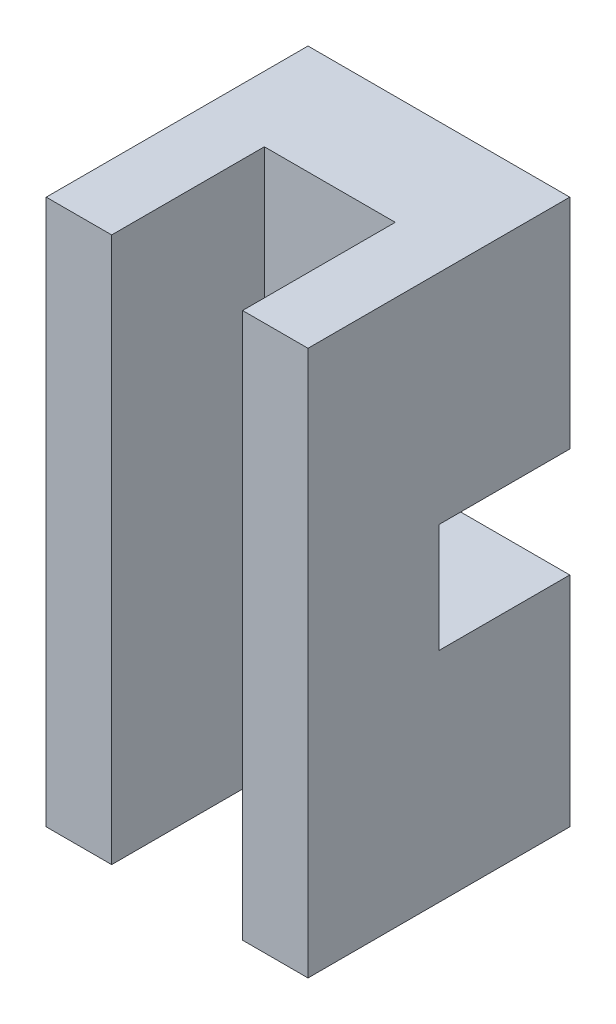
ISO-10303-21;
HEADER;
FILE_DESCRIPTION(('STEP AP214'),'2;1');
FILE_NAME('part.step','',(''),(''),'','','');
FILE_SCHEMA(('AUTOMOTIVE_DESIGN { 1 0 10303 214 1 1 1 1 }'));
ENDSEC;
DATA;
#1=APPLICATION_CONTEXT('core data for automotive mechanical design processes');
#2=APPLICATION_PROTOCOL_DEFINITION('international standard','automotive_design',2000,#1);
#3=PRODUCT_CONTEXT('',#1,'mechanical');
#4=PRODUCT('Part','Part','',(#3));
#5=PRODUCT_RELATED_PRODUCT_CATEGORY('part','',(#4));
#6=PRODUCT_DEFINITION_FORMATION('','',#4);
#7=PRODUCT_DEFINITION_CONTEXT('part definition',#1,'design');
#8=PRODUCT_DEFINITION('design','',#6,#7);
#9=PRODUCT_DEFINITION_SHAPE('','',#8);
#10=(LENGTH_UNIT() NAMED_UNIT(*) SI_UNIT(.MILLI.,.METRE.));
#11=(NAMED_UNIT(*) PLANE_ANGLE_UNIT() SI_UNIT($,.RADIAN.));
#12=(NAMED_UNIT(*) SI_UNIT($,.STERADIAN.) SOLID_ANGLE_UNIT());
#13=UNCERTAINTY_MEASURE_WITH_UNIT(LENGTH_MEASURE(1.E-05),#10,'distance_accuracy_value','');
#14=(GEOMETRIC_REPRESENTATION_CONTEXT(3) GLOBAL_UNCERTAINTY_ASSIGNED_CONTEXT((#13)) GLOBAL_UNIT_ASSIGNED_CONTEXT((#10,
#11,#12)) REPRESENTATION_CONTEXT('',''));
#15=CARTESIAN_POINT('',(0.,0.,0.));
#16=DIRECTION('',(0.,0.,1.));
#17=DIRECTION('',(1.,0.,0.));
#18=AXIS2_PLACEMENT_3D('',#15,#16,#17);
#19=CARTESIAN_POINT('',(30.,62.5,30.));
#20=DIRECTION('',(0.,0.,-1.));
#21=DIRECTION('',(-1.,0.,0.));
#22=AXIS2_PLACEMENT_3D('',#19,#20,#21);
#23=PLANE('',#22);
#24=DIRECTION('',(-1.,0.,0.));
#25=VECTOR('',#24,1.);
#26=CARTESIAN_POINT('',(30.,-62.5,30.));
#27=LINE('',#26,#25);
#28=CARTESIAN_POINT('',(-15.,-62.5,30.));
#29=VERTEX_POINT('',#28);
#30=CARTESIAN_POINT('',(-30.,-62.5,30.));
#31=VERTEX_POINT('',#30);
#32=EDGE_CURVE('E47',#29,#31,#27,.T.);
#33=ORIENTED_EDGE('',*,*,#32,.F.);
#34=DIRECTION('',(0.,1.,0.));
#35=VECTOR('',#34,1.);
#36=CARTESIAN_POINT('',(-15.,-62.5,30.));
#37=LINE('',#36,#35);
#38=CARTESIAN_POINT('',(-15.,62.5,30.));
#39=VERTEX_POINT('',#38);
#40=EDGE_CURVE('E248',#29,#39,#37,.T.);
#41=ORIENTED_EDGE('',*,*,#40,.T.);
#42=DIRECTION('',(-1.,0.,0.));
#43=VECTOR('',#42,1.);
#44=CARTESIAN_POINT('',(30.,62.5,30.));
#45=LINE('',#44,#43);
#46=CARTESIAN_POINT('',(-30.,62.5,30.));
#47=VERTEX_POINT('',#46);
#48=EDGE_CURVE('E200',#39,#47,#45,.T.);
#49=ORIENTED_EDGE('',*,*,#48,.T.);
#50=DIRECTION('',(0.,-1.,0.));
#51=VECTOR('',#50,1.);
#52=CARTESIAN_POINT('',(-30.,62.5,30.));
#53=LINE('',#52,#51);
#54=EDGE_CURVE('E201',#47,#31,#53,.T.);
#55=ORIENTED_EDGE('',*,*,#54,.T.);
#56=EDGE_LOOP('',(#33,#41,#49,#55));
#57=FACE_BOUND('',#56,.T.);
#58=ADVANCED_FACE('F39',(#57),#23,.F.);
#59=CARTESIAN_POINT('',(30.,-12.5,0.));
#60=DIRECTION('',(0.,0.,1.));
#61=DIRECTION('',(1.,0.,0.));
#62=AXIS2_PLACEMENT_3D('',#59,#60,#61);
#63=PLANE('',#62);
#64=DIRECTION('',(-1.,0.,0.));
#65=VECTOR('',#64,1.);
#66=CARTESIAN_POINT('',(30.,12.5,0.));
#67=LINE('',#66,#65);
#68=CARTESIAN_POINT('',(-15.,12.5,0.));
#69=VERTEX_POINT('',#68);
#70=CARTESIAN_POINT('',(-30.,12.5,0.));
#71=VERTEX_POINT('',#70);
#72=EDGE_CURVE('E224',#69,#71,#67,.T.);
#73=ORIENTED_EDGE('',*,*,#72,.F.);
#74=DIRECTION('',(0.,-1.,0.));
#75=VECTOR('',#74,1.);
#76=CARTESIAN_POINT('',(-15.,-12.5,0.));
#77=LINE('',#76,#75);
#78=CARTESIAN_POINT('',(-15.,-12.5,0.));
#79=VERTEX_POINT('',#78);
#80=EDGE_CURVE('E300',#69,#79,#77,.T.);
#81=ORIENTED_EDGE('',*,*,#80,.T.);
#82=DIRECTION('',(-1.,0.,0.));
#83=VECTOR('',#82,1.);
#84=CARTESIAN_POINT('',(30.,-12.5,0.));
#85=LINE('',#84,#83);
#86=CARTESIAN_POINT('',(-30.,-12.5,0.));
#87=VERTEX_POINT('',#86);
#88=EDGE_CURVE('E228',#79,#87,#85,.T.);
#89=ORIENTED_EDGE('',*,*,#88,.T.);
#90=DIRECTION('',(0.,1.,0.));
#91=VECTOR('',#90,1.);
#92=CARTESIAN_POINT('',(-30.,-12.5,0.));
#93=LINE('',#92,#91);
#94=EDGE_CURVE('E211',#87,#71,#93,.T.);
#95=ORIENTED_EDGE('',*,*,#94,.T.);
#96=EDGE_LOOP('',(#73,#81,#89,#95));
#97=FACE_BOUND('',#96,.T.);
#98=ADVANCED_FACE('F269',(#97),#63,.F.);
#99=CARTESIAN_POINT('',(30.,62.5,30.));
#100=VERTEX_POINT('',#99);
#101=CARTESIAN_POINT('',(15.,62.5,30.));
#102=VERTEX_POINT('',#101);
#103=EDGE_CURVE('E164',#100,#102,#45,.T.);
#104=ORIENTED_EDGE('',*,*,#103,.T.);
#105=DIRECTION('',(0.,1.,0.));
#106=VECTOR('',#105,1.);
#107=CARTESIAN_POINT('',(15.,-62.5,30.));
#108=LINE('',#107,#106);
#109=CARTESIAN_POINT('',(15.,-62.5,30.));
#110=VERTEX_POINT('',#109);
#111=EDGE_CURVE('E60',#110,#102,#108,.T.);
#112=ORIENTED_EDGE('',*,*,#111,.F.);
#113=CARTESIAN_POINT('',(30.,-62.5,30.));
#114=VERTEX_POINT('',#113);
#115=EDGE_CURVE('E11',#114,#110,#27,.T.);
#116=ORIENTED_EDGE('',*,*,#115,.F.);
#117=DIRECTION('',(0.,-1.,0.));
#118=VECTOR('',#117,1.);
#119=CARTESIAN_POINT('',(30.,62.5,30.));
#120=LINE('',#119,#118);
#121=EDGE_CURVE('E176',#100,#114,#120,.T.);
#122=ORIENTED_EDGE('',*,*,#121,.F.);
#123=EDGE_LOOP('',(#104,#112,#116,#122));
#124=FACE_BOUND('',#123,.T.);
#125=ADVANCED_FACE('F41',(#124),#23,.F.);
#126=CARTESIAN_POINT('',(30.,-62.5,30.));
#127=DIRECTION('',(0.,1.,0.));
#128=DIRECTION('',(0.,0.,1.));
#129=AXIS2_PLACEMENT_3D('',#126,#127,#128);
#130=PLANE('',#129);
#131=DIRECTION('',(-1.,0.,0.));
#132=VECTOR('',#131,1.);
#133=CARTESIAN_POINT('',(15.,-62.5,-5.00000000000002));
#134=LINE('',#133,#132);
#135=CARTESIAN_POINT('',(15.,-62.5,-5.00000000000002));
#136=VERTEX_POINT('',#135);
#137=CARTESIAN_POINT('',(-15.,-62.5,-5.00000000000002));
#138=VERTEX_POINT('',#137);
#139=EDGE_CURVE('E156',#136,#138,#134,.T.);
#140=ORIENTED_EDGE('',*,*,#139,.T.);
#141=DIRECTION('',(0.,0.,1.));
#142=VECTOR('',#141,1.);
#143=CARTESIAN_POINT('',(-15.,-62.5,-5.00000000000002));
#144=LINE('',#143,#142);
#145=EDGE_CURVE('E165',#138,#29,#144,.T.);
#146=ORIENTED_EDGE('',*,*,#145,.T.);
#147=ORIENTED_EDGE('',*,*,#32,.T.);
#148=DIRECTION('',(0.,0.,-1.));
#149=VECTOR('',#148,1.);
#150=CARTESIAN_POINT('',(-30.,-62.5,30.));
#151=LINE('',#150,#149);
#152=CARTESIAN_POINT('',(-30.,-62.5,-30.));
#153=VERTEX_POINT('',#152);
#154=EDGE_CURVE('E204',#31,#153,#151,.T.);
#155=ORIENTED_EDGE('',*,*,#154,.T.);
#156=DIRECTION('',(-1.,0.,0.));
#157=VECTOR('',#156,1.);
#158=CARTESIAN_POINT('',(30.,-62.5,-30.));
#159=LINE('',#158,#157);
#160=CARTESIAN_POINT('',(30.,-62.5,-30.));
#161=VERTEX_POINT('',#160);
#162=EDGE_CURVE('E172',#161,#153,#159,.T.);
#163=ORIENTED_EDGE('',*,*,#162,.F.);
#164=DIRECTION('',(0.,0.,-1.));
#165=VECTOR('',#164,1.);
#166=CARTESIAN_POINT('',(30.,-62.5,30.));
#167=LINE('',#166,#165);
#168=EDGE_CURVE('E169',#114,#161,#167,.T.);
#169=ORIENTED_EDGE('',*,*,#168,.F.);
#170=ORIENTED_EDGE('',*,*,#115,.T.);
#171=DIRECTION('',(0.,0.,-1.));
#172=VECTOR('',#171,1.);
#173=CARTESIAN_POINT('',(15.,-62.5,30.));
#174=LINE('',#173,#172);
#175=EDGE_CURVE('E149',#110,#136,#174,.T.);
#176=ORIENTED_EDGE('',*,*,#175,.T.);
#177=EDGE_LOOP('',(#140,#146,#147,#155,#163,#169,#170,#176));
#178=FACE_BOUND('',#177,.T.);
#179=ADVANCED_FACE('F167',(#178),#130,.F.);
#180=CARTESIAN_POINT('',(30.,-62.5,-30.));
#181=DIRECTION('',(0.,0.,1.));
#182=DIRECTION('',(0.,-1.,0.));
#183=AXIS2_PLACEMENT_3D('',#180,#181,#182);
#184=PLANE('',#183);
#185=CARTESIAN_POINT('',(0.,-37.5,-30.));
#186=DIRECTION('',(0.,0.,1.));
#187=DIRECTION('',(1.,0.,0.));
#188=AXIS2_PLACEMENT_3D('',#185,#186,#187);
#189=CIRCLE('',#188,5.);
#190=CARTESIAN_POINT('',(5.,-37.5,-30.));
#191=VERTEX_POINT('',#190);
#192=EDGE_CURVE('E315',#191,#191,#189,.T.);
#193=ORIENTED_EDGE('',*,*,#192,.T.);
#194=EDGE_LOOP('',(#193));
#195=FACE_BOUND('',#194,.T.);
#196=DIRECTION('',(0.,1.,0.));
#197=VECTOR('',#196,1.);
#198=CARTESIAN_POINT('',(-30.,-62.5,-30.));
#199=LINE('',#198,#197);
#200=CARTESIAN_POINT('',(-30.,-12.5,-30.));
#201=VERTEX_POINT('',#200);
#202=EDGE_CURVE('E206',#153,#201,#199,.T.);
#203=ORIENTED_EDGE('',*,*,#202,.T.);
#204=DIRECTION('',(-1.,0.,0.));
#205=VECTOR('',#204,1.);
#206=CARTESIAN_POINT('',(30.,-12.5,-30.));
#207=LINE('',#206,#205);
#208=CARTESIAN_POINT('',(30.,-12.5,-30.));
#209=VERTEX_POINT('',#208);
#210=EDGE_CURVE('E232',#209,#201,#207,.T.);
#211=ORIENTED_EDGE('',*,*,#210,.F.);
#212=DIRECTION('',(0.,1.,0.));
#213=VECTOR('',#212,1.);
#214=CARTESIAN_POINT('',(30.,-62.5,-30.));
#215=LINE('',#214,#213);
#216=EDGE_CURVE('E175',#161,#209,#215,.T.);
#217=ORIENTED_EDGE('',*,*,#216,.F.);
#218=ORIENTED_EDGE('',*,*,#162,.T.);
#219=EDGE_LOOP('',(#203,#211,#217,#218));
#220=FACE_BOUND('',#219,.T.);
#221=ADVANCED_FACE('F277',(#195,#220),#184,.F.);
#222=CARTESIAN_POINT('',(30.,-12.5,-30.));
#223=DIRECTION('',(0.,-1.,0.));
#224=DIRECTION('',(0.,0.,-1.));
#225=AXIS2_PLACEMENT_3D('',#222,#223,#224);
#226=PLANE('',#225);
#227=ORIENTED_EDGE('',*,*,#88,.F.);
#228=DIRECTION('',(0.,0.,-1.));
#229=VECTOR('',#228,1.);
#230=CARTESIAN_POINT('',(-15.,-12.5,-30.));
#231=LINE('',#230,#229);
#232=CARTESIAN_POINT('',(-15.,-12.5,-5.00000000000002));
#233=VERTEX_POINT('',#232);
#234=EDGE_CURVE('E187',#79,#233,#231,.T.);
#235=ORIENTED_EDGE('',*,*,#234,.T.);
#236=DIRECTION('',(1.,0.,0.));
#237=VECTOR('',#236,1.);
#238=CARTESIAN_POINT('',(30.,-12.5,-5.00000000000002));
#239=LINE('',#238,#237);
#240=CARTESIAN_POINT('',(15.,-12.5,-5.00000000000002));
#241=VERTEX_POINT('',#240);
#242=EDGE_CURVE('E298',#233,#241,#239,.T.);
#243=ORIENTED_EDGE('',*,*,#242,.T.);
#244=DIRECTION('',(0.,0.,1.));
#245=VECTOR('',#244,1.);
#246=CARTESIAN_POINT('',(15.,-12.5,-30.));
#247=LINE('',#246,#245);
#248=CARTESIAN_POINT('',(15.,-12.5,0.));
#249=VERTEX_POINT('',#248);
#250=EDGE_CURVE('E282',#241,#249,#247,.T.);
#251=ORIENTED_EDGE('',*,*,#250,.T.);
#252=CARTESIAN_POINT('',(30.,-12.5,0.));
#253=VERTEX_POINT('',#252);
#254=EDGE_CURVE('E229',#253,#249,#85,.T.);
#255=ORIENTED_EDGE('',*,*,#254,.F.);
#256=DIRECTION('',(0.,0.,1.));
#257=VECTOR('',#256,1.);
#258=CARTESIAN_POINT('',(30.,-12.5,-30.));
#259=LINE('',#258,#257);
#260=EDGE_CURVE('E191',#209,#253,#259,.T.);
#261=ORIENTED_EDGE('',*,*,#260,.F.);
#262=ORIENTED_EDGE('',*,*,#210,.T.);
#263=DIRECTION('',(0.,0.,1.));
#264=VECTOR('',#263,1.);
#265=CARTESIAN_POINT('',(-30.,-12.5,-30.));
#266=LINE('',#265,#264);
#267=EDGE_CURVE('E208',#201,#87,#266,.T.);
#268=ORIENTED_EDGE('',*,*,#267,.T.);
#269=EDGE_LOOP('',(#227,#235,#243,#251,#255,#261,#262,#268));
#270=FACE_BOUND('',#269,.T.);
#271=ADVANCED_FACE('F272',(#270),#226,.F.);
#272=ORIENTED_EDGE('',*,*,#254,.T.);
#273=DIRECTION('',(0.,1.,0.));
#274=VECTOR('',#273,1.);
#275=CARTESIAN_POINT('',(15.,-12.5,0.));
#276=LINE('',#275,#274);
#277=CARTESIAN_POINT('',(15.,12.5,0.));
#278=VERTEX_POINT('',#277);
#279=EDGE_CURVE('E286',#249,#278,#276,.T.);
#280=ORIENTED_EDGE('',*,*,#279,.T.);
#281=CARTESIAN_POINT('',(30.,12.5,0.));
#282=VERTEX_POINT('',#281);
#283=EDGE_CURVE('E225',#282,#278,#67,.T.);
#284=ORIENTED_EDGE('',*,*,#283,.F.);
#285=DIRECTION('',(0.,1.,0.));
#286=VECTOR('',#285,1.);
#287=CARTESIAN_POINT('',(30.,-12.5,0.));
#288=LINE('',#287,#286);
#289=EDGE_CURVE('E193',#253,#282,#288,.T.);
#290=ORIENTED_EDGE('',*,*,#289,.F.);
#291=EDGE_LOOP('',(#272,#280,#284,#290));
#292=FACE_BOUND('',#291,.T.);
#293=ADVANCED_FACE('F285',(#292),#63,.F.);
#294=CARTESIAN_POINT('',(30.,12.5,0.));
#295=DIRECTION('',(0.,1.,0.));
#296=DIRECTION('',(0.,0.,1.));
#297=AXIS2_PLACEMENT_3D('',#294,#295,#296);
#298=PLANE('',#297);
#299=DIRECTION('',(-1.,0.,0.));
#300=VECTOR('',#299,1.);
#301=CARTESIAN_POINT('',(30.,12.5,-5.00000000000002));
#302=LINE('',#301,#300);
#303=CARTESIAN_POINT('',(15.,12.5,-5.00000000000002));
#304=VERTEX_POINT('',#303);
#305=CARTESIAN_POINT('',(-15.,12.5,-5.00000000000002));
#306=VERTEX_POINT('',#305);
#307=EDGE_CURVE('E289',#304,#306,#302,.T.);
#308=ORIENTED_EDGE('',*,*,#307,.T.);
#309=DIRECTION('',(0.,0.,1.));
#310=VECTOR('',#309,1.);
#311=CARTESIAN_POINT('',(-15.,12.5,0.));
#312=LINE('',#311,#310);
#313=EDGE_CURVE('E266',#306,#69,#312,.T.);
#314=ORIENTED_EDGE('',*,*,#313,.T.);
#315=ORIENTED_EDGE('',*,*,#72,.T.);
#316=DIRECTION('',(0.,0.,-1.));
#317=VECTOR('',#316,1.);
#318=CARTESIAN_POINT('',(-30.,12.5,0.));
#319=LINE('',#318,#317);
#320=CARTESIAN_POINT('',(-30.,12.5,-30.));
#321=VERTEX_POINT('',#320);
#322=EDGE_CURVE('E214',#71,#321,#319,.T.);
#323=ORIENTED_EDGE('',*,*,#322,.T.);
#324=DIRECTION('',(-1.,0.,0.));
#325=VECTOR('',#324,1.);
#326=CARTESIAN_POINT('',(30.,12.5,-30.));
#327=LINE('',#326,#325);
#328=CARTESIAN_POINT('',(30.,12.5,-30.));
#329=VERTEX_POINT('',#328);
#330=EDGE_CURVE('E221',#329,#321,#327,.T.);
#331=ORIENTED_EDGE('',*,*,#330,.F.);
#332=DIRECTION('',(0.,0.,-1.));
#333=VECTOR('',#332,1.);
#334=CARTESIAN_POINT('',(30.,12.5,0.));
#335=LINE('',#334,#333);
#336=EDGE_CURVE('E195',#282,#329,#335,.T.);
#337=ORIENTED_EDGE('',*,*,#336,.F.);
#338=ORIENTED_EDGE('',*,*,#283,.T.);
#339=DIRECTION('',(0.,0.,-1.));
#340=VECTOR('',#339,1.);
#341=CARTESIAN_POINT('',(15.,12.5,0.));
#342=LINE('',#341,#340);
#343=EDGE_CURVE('E288',#278,#304,#342,.T.);
#344=ORIENTED_EDGE('',*,*,#343,.T.);
#345=EDGE_LOOP('',(#308,#314,#315,#323,#331,#337,#338,#344));
#346=FACE_BOUND('',#345,.T.);
#347=ADVANCED_FACE('F263',(#346),#298,.F.);
#348=CARTESIAN_POINT('',(30.,12.5,-30.));
#349=DIRECTION('',(0.,0.,1.));
#350=DIRECTION('',(1.,0.,0.));
#351=AXIS2_PLACEMENT_3D('',#348,#349,#350);
#352=PLANE('',#351);
#353=CARTESIAN_POINT('',(0.,37.5,-30.));
#354=DIRECTION('',(0.,0.,1.));
#355=DIRECTION('',(-1.,0.,0.));
#356=AXIS2_PLACEMENT_3D('',#353,#354,#355);
#357=CIRCLE('',#356,5.);
#358=CARTESIAN_POINT('',(5.,37.5,-30.));
#359=VERTEX_POINT('',#358);
#360=EDGE_CURVE('E321',#359,#359,#357,.T.);
#361=ORIENTED_EDGE('',*,*,#360,.T.);
#362=EDGE_LOOP('',(#361));
#363=FACE_BOUND('',#362,.T.);
#364=DIRECTION('',(0.,1.,0.));
#365=VECTOR('',#364,1.);
#366=CARTESIAN_POINT('',(-30.,12.5,-30.));
#367=LINE('',#366,#365);
#368=CARTESIAN_POINT('',(-30.,62.5,-30.));
#369=VERTEX_POINT('',#368);
#370=EDGE_CURVE('E184',#321,#369,#367,.T.);
#371=ORIENTED_EDGE('',*,*,#370,.T.);
#372=DIRECTION('',(-1.,0.,0.));
#373=VECTOR('',#372,1.);
#374=CARTESIAN_POINT('',(30.,62.5,-30.));
#375=LINE('',#374,#373);
#376=CARTESIAN_POINT('',(30.,62.5,-30.));
#377=VERTEX_POINT('',#376);
#378=EDGE_CURVE('E218',#377,#369,#375,.T.);
#379=ORIENTED_EDGE('',*,*,#378,.F.);
#380=DIRECTION('',(0.,1.,0.));
#381=VECTOR('',#380,1.);
#382=CARTESIAN_POINT('',(30.,12.5,-30.));
#383=LINE('',#382,#381);
#384=EDGE_CURVE('E197',#329,#377,#383,.T.);
#385=ORIENTED_EDGE('',*,*,#384,.F.);
#386=ORIENTED_EDGE('',*,*,#330,.T.);
#387=EDGE_LOOP('',(#371,#379,#385,#386));
#388=FACE_BOUND('',#387,.T.);
#389=ADVANCED_FACE('F257',(#363,#388),#352,.F.);
#390=CARTESIAN_POINT('',(30.,62.5,-30.));
#391=DIRECTION('',(0.,-1.,0.));
#392=DIRECTION('',(0.,0.,-1.));
#393=AXIS2_PLACEMENT_3D('',#390,#391,#392);
#394=PLANE('',#393);
#395=ORIENTED_EDGE('',*,*,#48,.F.);
#396=DIRECTION('',(0.,0.,1.));
#397=VECTOR('',#396,1.);
#398=CARTESIAN_POINT('',(-15.,62.5,-5.00000000000002));
#399=LINE('',#398,#397);
#400=CARTESIAN_POINT('',(-15.,62.5,-5.00000000000002));
#401=VERTEX_POINT('',#400);
#402=EDGE_CURVE('E157',#401,#39,#399,.T.);
#403=ORIENTED_EDGE('',*,*,#402,.F.);
#404=DIRECTION('',(-1.,0.,0.));
#405=VECTOR('',#404,1.);
#406=CARTESIAN_POINT('',(15.,62.5,-5.00000000000002));
#407=LINE('',#406,#405);
#408=CARTESIAN_POINT('',(15.,62.5,-5.00000000000002));
#409=VERTEX_POINT('',#408);
#410=EDGE_CURVE('E313',#409,#401,#407,.T.);
#411=ORIENTED_EDGE('',*,*,#410,.F.);
#412=DIRECTION('',(0.,0.,-1.));
#413=VECTOR('',#412,1.);
#414=CARTESIAN_POINT('',(15.,62.5,30.));
#415=LINE('',#414,#413);
#416=EDGE_CURVE('E314',#102,#409,#415,.T.);
#417=ORIENTED_EDGE('',*,*,#416,.F.);
#418=ORIENTED_EDGE('',*,*,#103,.F.);
#419=DIRECTION('',(0.,0.,1.));
#420=VECTOR('',#419,1.);
#421=CARTESIAN_POINT('',(30.,62.5,-30.));
#422=LINE('',#421,#420);
#423=EDGE_CURVE('E180',#377,#100,#422,.T.);
#424=ORIENTED_EDGE('',*,*,#423,.F.);
#425=ORIENTED_EDGE('',*,*,#378,.T.);
#426=DIRECTION('',(0.,0.,1.));
#427=VECTOR('',#426,1.);
#428=CARTESIAN_POINT('',(-30.,62.5,-30.));
#429=LINE('',#428,#427);
#430=EDGE_CURVE('E181',#369,#47,#429,.T.);
#431=ORIENTED_EDGE('',*,*,#430,.T.);
#432=EDGE_LOOP('',(#395,#403,#411,#417,#418,#424,#425,#431));
#433=FACE_BOUND('',#432,.T.);
#434=ADVANCED_FACE('F251',(#433),#394,.F.);
#435=CARTESIAN_POINT('',(30.,0.,0.));
#436=DIRECTION('',(1.,0.,0.));
#437=DIRECTION('',(0.,0.,-1.));
#438=AXIS2_PLACEMENT_3D('',#435,#436,#437);
#439=PLANE('',#438);
#440=ORIENTED_EDGE('',*,*,#121,.T.);
#441=ORIENTED_EDGE('',*,*,#168,.T.);
#442=ORIENTED_EDGE('',*,*,#216,.T.);
#443=ORIENTED_EDGE('',*,*,#260,.T.);
#444=ORIENTED_EDGE('',*,*,#289,.T.);
#445=ORIENTED_EDGE('',*,*,#336,.T.);
#446=ORIENTED_EDGE('',*,*,#384,.T.);
#447=ORIENTED_EDGE('',*,*,#423,.T.);
#448=EDGE_LOOP('',(#440,#441,#442,#443,#444,#445,#446,#447));
#449=FACE_BOUND('',#448,.T.);
#450=ADVANCED_FACE('F178',(#449),#439,.T.);
#451=CARTESIAN_POINT('',(-30.,0.,0.));
#452=DIRECTION('',(1.,0.,0.));
#453=DIRECTION('',(0.,0.,-1.));
#454=AXIS2_PLACEMENT_3D('',#451,#452,#453);
#455=PLANE('',#454);
#456=ORIENTED_EDGE('',*,*,#54,.F.);
#457=ORIENTED_EDGE('',*,*,#430,.F.);
#458=ORIENTED_EDGE('',*,*,#370,.F.);
#459=ORIENTED_EDGE('',*,*,#322,.F.);
#460=ORIENTED_EDGE('',*,*,#94,.F.);
#461=ORIENTED_EDGE('',*,*,#267,.F.);
#462=ORIENTED_EDGE('',*,*,#202,.F.);
#463=ORIENTED_EDGE('',*,*,#154,.F.);
#464=EDGE_LOOP('',(#456,#457,#458,#459,#460,#461,#462,#463));
#465=FACE_BOUND('',#464,.T.);
#466=ADVANCED_FACE('F244',(#465),#455,.F.);
#467=CARTESIAN_POINT('',(-15.,-62.5,-5.00000000000002));
#468=DIRECTION('',(-1.,0.,0.));
#469=DIRECTION('',(0.,0.,1.));
#470=AXIS2_PLACEMENT_3D('',#467,#468,#469);
#471=PLANE('',#470);
#472=ORIENTED_EDGE('',*,*,#80,.F.);
#473=ORIENTED_EDGE('',*,*,#313,.F.);
#474=DIRECTION('',(0.,1.,0.));
#475=VECTOR('',#474,1.);
#476=CARTESIAN_POINT('',(-15.,-62.5,-5.00000000000002));
#477=LINE('',#476,#475);
#478=EDGE_CURVE('E305',#306,#401,#477,.T.);
#479=ORIENTED_EDGE('',*,*,#478,.T.);
#480=ORIENTED_EDGE('',*,*,#402,.T.);
#481=ORIENTED_EDGE('',*,*,#40,.F.);
#482=ORIENTED_EDGE('',*,*,#145,.F.);
#483=EDGE_CURVE('E292',#138,#233,#477,.T.);
#484=ORIENTED_EDGE('',*,*,#483,.T.);
#485=ORIENTED_EDGE('',*,*,#234,.F.);
#486=EDGE_LOOP('',(#472,#473,#479,#480,#481,#482,#484,#485));
#487=FACE_BOUND('',#486,.T.);
#488=ADVANCED_FACE('F303',(#487),#471,.F.);
#489=CARTESIAN_POINT('',(15.,-62.5,-5.00000000000002));
#490=DIRECTION('',(0.,0.,-1.));
#491=DIRECTION('',(-1.,0.,0.));
#492=AXIS2_PLACEMENT_3D('',#489,#490,#491);
#493=PLANE('',#492);
#494=CARTESIAN_POINT('',(0.,-37.5,-5.00000000000002));
#495=DIRECTION('',(0.,0.,1.));
#496=DIRECTION('',(1.,0.,0.));
#497=AXIS2_PLACEMENT_3D('',#494,#495,#496);
#498=CIRCLE('',#497,5.);
#499=CARTESIAN_POINT('',(5.,-37.5,-5.00000000000002));
#500=VERTEX_POINT('',#499);
#501=EDGE_CURVE('E327',#500,#500,#498,.T.);
#502=ORIENTED_EDGE('',*,*,#501,.F.);
#503=EDGE_LOOP('',(#502));
#504=FACE_BOUND('',#503,.T.);
#505=ORIENTED_EDGE('',*,*,#483,.F.);
#506=ORIENTED_EDGE('',*,*,#139,.F.);
#507=DIRECTION('',(0.,1.,0.));
#508=VECTOR('',#507,1.);
#509=CARTESIAN_POINT('',(15.,-62.5,-5.00000000000002));
#510=LINE('',#509,#508);
#511=EDGE_CURVE('E152',#136,#241,#510,.T.);
#512=ORIENTED_EDGE('',*,*,#511,.T.);
#513=ORIENTED_EDGE('',*,*,#242,.F.);
#514=EDGE_LOOP('',(#505,#506,#512,#513));
#515=FACE_BOUND('',#514,.T.);
#516=ADVANCED_FACE('F341',(#504,#515),#493,.F.);
#517=CARTESIAN_POINT('',(0.,37.5,-5.00000000000002));
#518=DIRECTION('',(0.,0.,1.));
#519=DIRECTION('',(-1.,0.,0.));
#520=AXIS2_PLACEMENT_3D('',#517,#518,#519);
#521=CIRCLE('',#520,5.);
#522=CARTESIAN_POINT('',(5.,37.5,-5.00000000000002));
#523=VERTEX_POINT('',#522);
#524=EDGE_CURVE('E324',#523,#523,#521,.T.);
#525=ORIENTED_EDGE('',*,*,#524,.F.);
#526=EDGE_LOOP('',(#525));
#527=FACE_BOUND('',#526,.T.);
#528=EDGE_CURVE('E54',#304,#409,#510,.T.);
#529=ORIENTED_EDGE('',*,*,#528,.T.);
#530=ORIENTED_EDGE('',*,*,#410,.T.);
#531=ORIENTED_EDGE('',*,*,#478,.F.);
#532=ORIENTED_EDGE('',*,*,#307,.F.);
#533=EDGE_LOOP('',(#529,#530,#531,#532));
#534=FACE_BOUND('',#533,.T.);
#535=ADVANCED_FACE('F310',(#527,#534),#493,.F.);
#536=CARTESIAN_POINT('',(15.,-62.5,30.));
#537=DIRECTION('',(1.,0.,0.));
#538=DIRECTION('',(0.,0.,-1.));
#539=AXIS2_PLACEMENT_3D('',#536,#537,#538);
#540=PLANE('',#539);
#541=ORIENTED_EDGE('',*,*,#511,.F.);
#542=ORIENTED_EDGE('',*,*,#175,.F.);
#543=ORIENTED_EDGE('',*,*,#111,.T.);
#544=ORIENTED_EDGE('',*,*,#416,.T.);
#545=ORIENTED_EDGE('',*,*,#528,.F.);
#546=ORIENTED_EDGE('',*,*,#343,.F.);
#547=ORIENTED_EDGE('',*,*,#279,.F.);
#548=ORIENTED_EDGE('',*,*,#250,.F.);
#549=EDGE_LOOP('',(#541,#542,#543,#544,#545,#546,#547,#548));
#550=FACE_BOUND('',#549,.T.);
#551=ADVANCED_FACE('F150',(#550),#540,.F.);
#552=CARTESIAN_POINT('',(0.,37.5,-30.));
#553=DIRECTION('',(0.,0.,1.));
#554=DIRECTION('',(1.,0.,0.));
#555=AXIS2_PLACEMENT_3D('',#552,#553,#554);
#556=CYLINDRICAL_SURFACE('',#555,5.);
#557=CARTESIAN_POINT('',(5.,37.5,-30.));
#558=CARTESIAN_POINT('',(5.,37.5,-29.7395833333333));
#559=CARTESIAN_POINT('',(5.,37.5,-29.4791666666667));
#560=CARTESIAN_POINT('',(5.,37.5,-28.9583333333333));
#561=CARTESIAN_POINT('',(5.,37.5,-28.6979166666667));
#562=CARTESIAN_POINT('',(5.,37.5,-28.1770833333333));
#563=CARTESIAN_POINT('',(5.,37.5,-27.9166666666667));
#564=CARTESIAN_POINT('',(5.,37.5,-27.3958333333333));
#565=CARTESIAN_POINT('',(5.,37.5,-27.1354166666667));
#566=CARTESIAN_POINT('',(5.,37.5,-26.6145833333333));
#567=CARTESIAN_POINT('',(5.,37.5,-26.3541666666667));
#568=CARTESIAN_POINT('',(5.,37.5,-25.8333333333333));
#569=CARTESIAN_POINT('',(5.,37.5,-25.5729166666667));
#570=CARTESIAN_POINT('',(5.,37.5,-25.0520833333333));
#571=CARTESIAN_POINT('',(5.,37.5,-24.7916666666667));
#572=CARTESIAN_POINT('',(5.,37.5,-24.2708333333333));
#573=CARTESIAN_POINT('',(5.,37.5,-24.0104166666667));
#574=CARTESIAN_POINT('',(5.,37.5,-23.4895833333333));
#575=CARTESIAN_POINT('',(5.,37.5,-23.2291666666667));
#576=CARTESIAN_POINT('',(5.,37.5,-22.7083333333333));
#577=CARTESIAN_POINT('',(5.,37.5,-22.4479166666667));
#578=CARTESIAN_POINT('',(5.,37.5,-21.9270833333333));
#579=CARTESIAN_POINT('',(5.,37.5,-21.6666666666667));
#580=CARTESIAN_POINT('',(5.,37.5,-21.1458333333333));
#581=CARTESIAN_POINT('',(5.,37.5,-20.8854166666667));
#582=CARTESIAN_POINT('',(5.,37.5,-20.3645833333333));
#583=CARTESIAN_POINT('',(5.,37.5,-20.1041666666667));
#584=CARTESIAN_POINT('',(5.,37.5,-19.5833333333333));
#585=CARTESIAN_POINT('',(5.,37.5,-19.3229166666667));
#586=CARTESIAN_POINT('',(5.,37.5,-18.8020833333333));
#587=CARTESIAN_POINT('',(5.,37.5,-18.5416666666667));
#588=CARTESIAN_POINT('',(5.,37.5,-18.0208333333333));
#589=CARTESIAN_POINT('',(5.,37.5,-17.7604166666667));
#590=CARTESIAN_POINT('',(5.,37.5,-17.2395833333333));
#591=CARTESIAN_POINT('',(5.,37.5,-16.9791666666667));
#592=CARTESIAN_POINT('',(5.,37.5,-16.4583333333333));
#593=CARTESIAN_POINT('',(5.,37.5,-16.1979166666667));
#594=CARTESIAN_POINT('',(5.,37.5,-15.6770833333333));
#595=CARTESIAN_POINT('',(5.,37.5,-15.4166666666667));
#596=CARTESIAN_POINT('',(5.,37.5,-14.8958333333333));
#597=CARTESIAN_POINT('',(5.,37.5,-14.6354166666667));
#598=CARTESIAN_POINT('',(5.,37.5,-14.1145833333333));
#599=CARTESIAN_POINT('',(5.,37.5,-13.8541666666667));
#600=CARTESIAN_POINT('',(5.,37.5,-13.3333333333334));
#601=CARTESIAN_POINT('',(5.,37.5,-13.0729166666667));
#602=CARTESIAN_POINT('',(5.,37.5,-12.5520833333334));
#603=CARTESIAN_POINT('',(5.,37.5,-12.2916666666667));
#604=CARTESIAN_POINT('',(5.,37.5,-11.7708333333334));
#605=CARTESIAN_POINT('',(5.,37.5,-11.5104166666667));
#606=CARTESIAN_POINT('',(5.,37.5,-10.9895833333334));
#607=CARTESIAN_POINT('',(5.,37.5,-10.7291666666667));
#608=CARTESIAN_POINT('',(5.,37.5,-10.2083333333334));
#609=CARTESIAN_POINT('',(5.,37.5,-9.94791666666669));
#610=CARTESIAN_POINT('',(5.,37.5,-9.42708333333336));
#611=CARTESIAN_POINT('',(5.,37.5,-9.16666666666669));
#612=CARTESIAN_POINT('',(5.,37.5,-8.64583333333336));
#613=CARTESIAN_POINT('',(5.,37.5,-8.38541666666669));
#614=CARTESIAN_POINT('',(5.,37.5,-7.86458333333336));
#615=CARTESIAN_POINT('',(5.,37.5,-7.60416666666669));
#616=CARTESIAN_POINT('',(5.,37.5,-7.08333333333336));
#617=CARTESIAN_POINT('',(5.,37.5,-6.82291666666669));
#618=CARTESIAN_POINT('',(5.,37.5,-6.30208333333336));
#619=CARTESIAN_POINT('',(5.,37.5,-6.04166666666669));
#620=CARTESIAN_POINT('',(5.,37.5,-5.52083333333336));
#621=CARTESIAN_POINT('',(5.,37.5,-5.26041666666669));
#622=CARTESIAN_POINT('',(5.,37.5,-5.00000000000002));
#623=B_SPLINE_CURVE_WITH_KNOTS('',3,(#557,#558,#559,#560,#561,#562,#563,#564,#565,#566,#567,
#568,#569,#570,#571,#572,#573,#574,#575,#576,#577,#578,#579,#580,#581,#582,#583,#584,#585,#586,
#587,#588,#589,#590,#591,#592,#593,#594,#595,#596,#597,#598,#599,#600,#601,#602,#603,#604,#605,
#606,#607,#608,#609,#610,#611,#612,#613,#614,#615,#616,#617,#618,#619,#620,#621,#622),
.UNSPECIFIED.,.F.,.F.,(4,2,2,2,2,2,2,2,2,2,2,2,2,2,2,2,2,2,2,2,2,2,2,2,2,2,2,2,2,2,2,2,4),(0.,
0.781250000000001,1.5625,2.34375,3.125,3.90625,4.6875,5.46875,6.25,7.03125,7.8125,
8.59374999999999,9.37499999999999,10.15625,10.9375,11.71875,12.5,13.28125,14.0625,14.84375,
15.625,16.40625,17.1875,17.96875,18.75,19.53125,20.3125,21.09375,21.875,22.65625,23.4375,
24.21875,25.),.UNSPECIFIED.);
#624=EDGE_CURVE('BSEAM337',#359,#523,#623,.T.);
#625=ORIENTED_EDGE('',*,*,#360,.F.);
#626=ORIENTED_EDGE('',*,*,#524,.T.);
#627=ORIENTED_EDGE('',*,*,#624,.T.);
#628=ORIENTED_EDGE('',*,*,#624,.F.);
#629=EDGE_LOOP('',(#625,#627,#626,#628));
#630=FACE_BOUND('',#629,.T.);
#631=ADVANCED_FACE('F337',(#630),#556,.F.);
#632=CARTESIAN_POINT('',(0.,-37.5,-30.));
#633=DIRECTION('',(0.,0.,1.));
#634=DIRECTION('',(1.,0.,0.));
#635=AXIS2_PLACEMENT_3D('',#632,#633,#634);
#636=CYLINDRICAL_SURFACE('',#635,5.);
#637=CARTESIAN_POINT('',(5.,-37.5,-30.));
#638=CARTESIAN_POINT('',(5.,-37.5,-29.7395833333333));
#639=CARTESIAN_POINT('',(5.,-37.5,-29.4791666666667));
#640=CARTESIAN_POINT('',(5.,-37.5,-28.9583333333333));
#641=CARTESIAN_POINT('',(5.,-37.5,-28.6979166666667));
#642=CARTESIAN_POINT('',(5.,-37.5,-28.1770833333333));
#643=CARTESIAN_POINT('',(5.,-37.5,-27.9166666666667));
#644=CARTESIAN_POINT('',(5.,-37.5,-27.3958333333333));
#645=CARTESIAN_POINT('',(5.,-37.5,-27.1354166666667));
#646=CARTESIAN_POINT('',(5.,-37.5,-26.6145833333333));
#647=CARTESIAN_POINT('',(5.,-37.5,-26.3541666666667));
#648=CARTESIAN_POINT('',(5.,-37.5,-25.8333333333333));
#649=CARTESIAN_POINT('',(5.,-37.5,-25.5729166666667));
#650=CARTESIAN_POINT('',(5.,-37.5,-25.0520833333333));
#651=CARTESIAN_POINT('',(5.,-37.5,-24.7916666666667));
#652=CARTESIAN_POINT('',(5.,-37.5,-24.2708333333333));
#653=CARTESIAN_POINT('',(5.,-37.5,-24.0104166666667));
#654=CARTESIAN_POINT('',(5.,-37.5,-23.4895833333333));
#655=CARTESIAN_POINT('',(5.,-37.5,-23.2291666666667));
#656=CARTESIAN_POINT('',(5.,-37.5,-22.7083333333333));
#657=CARTESIAN_POINT('',(5.,-37.5,-22.4479166666667));
#658=CARTESIAN_POINT('',(5.,-37.5,-21.9270833333333));
#659=CARTESIAN_POINT('',(5.,-37.5,-21.6666666666667));
#660=CARTESIAN_POINT('',(5.,-37.5,-21.1458333333333));
#661=CARTESIAN_POINT('',(5.,-37.5,-20.8854166666667));
#662=CARTESIAN_POINT('',(5.,-37.5,-20.3645833333333));
#663=CARTESIAN_POINT('',(5.,-37.5,-20.1041666666667));
#664=CARTESIAN_POINT('',(5.,-37.5,-19.5833333333333));
#665=CARTESIAN_POINT('',(5.,-37.5,-19.3229166666667));
#666=CARTESIAN_POINT('',(5.,-37.5,-18.8020833333333));
#667=CARTESIAN_POINT('',(5.,-37.5,-18.5416666666667));
#668=CARTESIAN_POINT('',(5.,-37.5,-18.0208333333333));
#669=CARTESIAN_POINT('',(5.,-37.5,-17.7604166666667));
#670=CARTESIAN_POINT('',(5.,-37.5,-17.2395833333333));
#671=CARTESIAN_POINT('',(5.,-37.5,-16.9791666666667));
#672=CARTESIAN_POINT('',(5.,-37.5,-16.4583333333333));
#673=CARTESIAN_POINT('',(5.,-37.5,-16.1979166666667));
#674=CARTESIAN_POINT('',(5.,-37.5,-15.6770833333333));
#675=CARTESIAN_POINT('',(5.,-37.5,-15.4166666666667));
#676=CARTESIAN_POINT('',(5.,-37.5,-14.8958333333333));
#677=CARTESIAN_POINT('',(5.,-37.5,-14.6354166666667));
#678=CARTESIAN_POINT('',(5.,-37.5,-14.1145833333333));
#679=CARTESIAN_POINT('',(5.,-37.5,-13.8541666666667));
#680=CARTESIAN_POINT('',(5.,-37.5,-13.3333333333334));
#681=CARTESIAN_POINT('',(5.,-37.5,-13.0729166666667));
#682=CARTESIAN_POINT('',(5.,-37.5,-12.5520833333334));
#683=CARTESIAN_POINT('',(5.,-37.5,-12.2916666666667));
#684=CARTESIAN_POINT('',(5.,-37.5,-11.7708333333334));
#685=CARTESIAN_POINT('',(5.,-37.5,-11.5104166666667));
#686=CARTESIAN_POINT('',(5.,-37.5,-10.9895833333334));
#687=CARTESIAN_POINT('',(5.,-37.5,-10.7291666666667));
#688=CARTESIAN_POINT('',(5.,-37.5,-10.2083333333334));
#689=CARTESIAN_POINT('',(5.,-37.5,-9.94791666666669));
#690=CARTESIAN_POINT('',(5.,-37.5,-9.42708333333336));
#691=CARTESIAN_POINT('',(5.,-37.5,-9.16666666666669));
#692=CARTESIAN_POINT('',(5.,-37.5,-8.64583333333336));
#693=CARTESIAN_POINT('',(5.,-37.5,-8.38541666666669));
#694=CARTESIAN_POINT('',(5.,-37.5,-7.86458333333336));
#695=CARTESIAN_POINT('',(5.,-37.5,-7.60416666666669));
#696=CARTESIAN_POINT('',(5.,-37.5,-7.08333333333336));
#697=CARTESIAN_POINT('',(5.,-37.5,-6.82291666666669));
#698=CARTESIAN_POINT('',(5.,-37.5,-6.30208333333336));
#699=CARTESIAN_POINT('',(5.,-37.5,-6.04166666666669));
#700=CARTESIAN_POINT('',(5.,-37.5,-5.52083333333336));
#701=CARTESIAN_POINT('',(5.,-37.5,-5.26041666666669));
#702=CARTESIAN_POINT('',(5.,-37.5,-5.00000000000002));
#703=B_SPLINE_CURVE_WITH_KNOTS('',3,(#637,#638,#639,#640,#641,#642,#643,#644,#645,#646,#647,
#648,#649,#650,#651,#652,#653,#654,#655,#656,#657,#658,#659,#660,#661,#662,#663,#664,#665,#666,
#667,#668,#669,#670,#671,#672,#673,#674,#675,#676,#677,#678,#679,#680,#681,#682,#683,#684,#685,
#686,#687,#688,#689,#690,#691,#692,#693,#694,#695,#696,#697,#698,#699,#700,#701,#702),
.UNSPECIFIED.,.F.,.F.,(4,2,2,2,2,2,2,2,2,2,2,2,2,2,2,2,2,2,2,2,2,2,2,2,2,2,2,2,2,2,2,2,4),(0.,
0.781250000000001,1.5625,2.34375,3.125,3.90625,4.6875,5.46875,6.25,7.03125,7.8125,
8.59374999999999,9.37499999999999,10.15625,10.9375,11.71875,12.5,13.28125,14.0625,14.84375,
15.625,16.40625,17.1875,17.96875,18.75,19.53125,20.3125,21.09375,21.875,22.65625,23.4375,
24.21875,25.),.UNSPECIFIED.);
#704=EDGE_CURVE('BSEAM334',#191,#500,#703,.T.);
#705=ORIENTED_EDGE('',*,*,#192,.F.);
#706=ORIENTED_EDGE('',*,*,#501,.T.);
#707=ORIENTED_EDGE('',*,*,#704,.T.);
#708=ORIENTED_EDGE('',*,*,#704,.F.);
#709=EDGE_LOOP('',(#705,#707,#706,#708));
#710=FACE_BOUND('',#709,.T.);
#711=ADVANCED_FACE('F334',(#710),#636,.F.);
#712=CLOSED_SHELL('',(#58,#98,#125,#179,#221,#271,#293,#347,#389,#434,#450,#466,#488,#516,#535,
#551,#631,#711));
#713=MANIFOLD_SOLID_BREP('B2',#712);
#714=ADVANCED_BREP_SHAPE_REPRESENTATION('',(#18,#713),#14);
#715=SHAPE_DEFINITION_REPRESENTATION(#9,#714);
ENDSEC;
END-ISO-10303-21;
